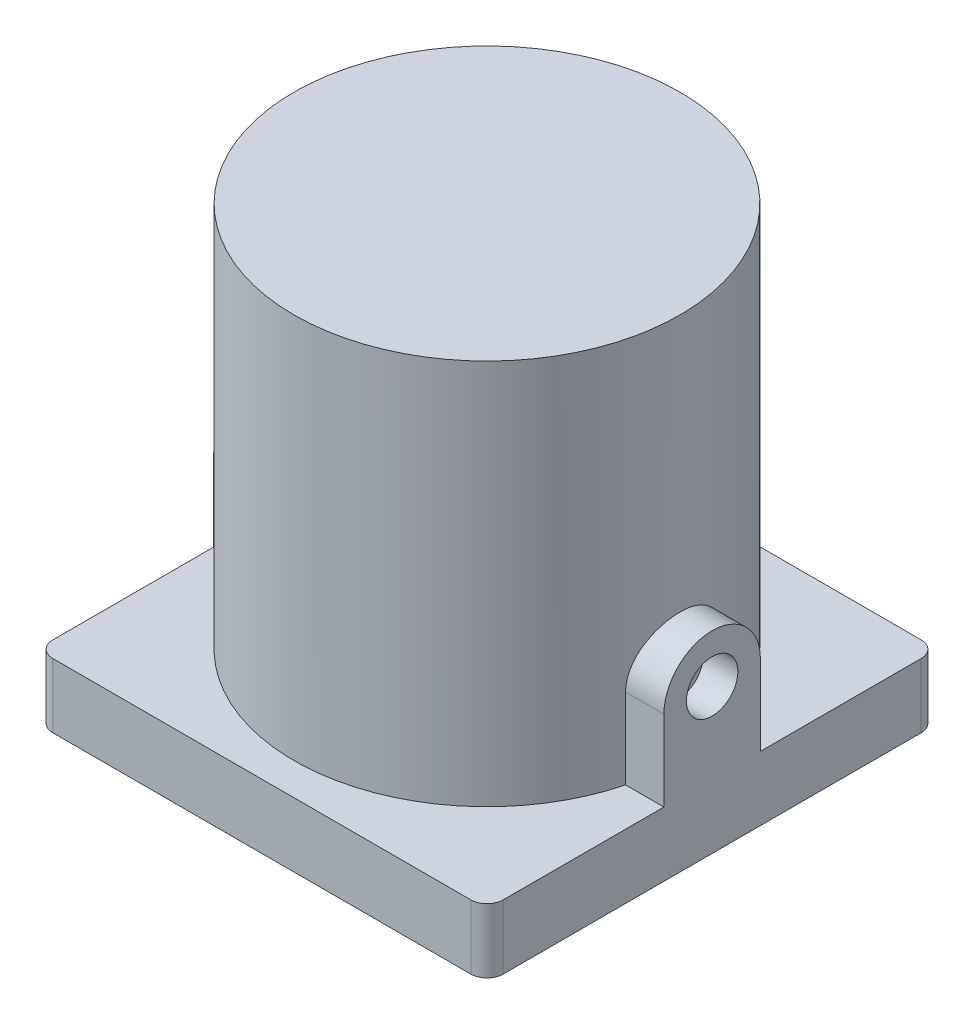
ISO-10303-21;
HEADER;
FILE_DESCRIPTION(('STEP AP214'),'2;1');
FILE_NAME('part.step','',(''),(''),'','','');
FILE_SCHEMA(('AUTOMOTIVE_DESIGN { 1 0 10303 214 1 1 1 1 }'));
ENDSEC;
DATA;
#1=APPLICATION_CONTEXT('core data for automotive mechanical design processes');
#2=APPLICATION_PROTOCOL_DEFINITION('international standard','automotive_design',2000,#1);
#3=PRODUCT_CONTEXT('',#1,'mechanical');
#4=PRODUCT('Part','Part','',(#3));
#5=PRODUCT_RELATED_PRODUCT_CATEGORY('part','',(#4));
#6=PRODUCT_DEFINITION_FORMATION('','',#4);
#7=PRODUCT_DEFINITION_CONTEXT('part definition',#1,'design');
#8=PRODUCT_DEFINITION('design','',#6,#7);
#9=PRODUCT_DEFINITION_SHAPE('','',#8);
#10=(LENGTH_UNIT() NAMED_UNIT(*) SI_UNIT(.MILLI.,.METRE.));
#11=(NAMED_UNIT(*) PLANE_ANGLE_UNIT() SI_UNIT($,.RADIAN.));
#12=(NAMED_UNIT(*) SI_UNIT($,.STERADIAN.) SOLID_ANGLE_UNIT());
#13=UNCERTAINTY_MEASURE_WITH_UNIT(LENGTH_MEASURE(1.E-05),#10,'distance_accuracy_value','');
#14=(GEOMETRIC_REPRESENTATION_CONTEXT(3) GLOBAL_UNCERTAINTY_ASSIGNED_CONTEXT((#13)) GLOBAL_UNIT_ASSIGNED_CONTEXT((#10,
#11,#12)) REPRESENTATION_CONTEXT('',''));
#15=CARTESIAN_POINT('',(0.,0.,0.));
#16=DIRECTION('',(0.,0.,1.));
#17=DIRECTION('',(1.,0.,0.));
#18=AXIS2_PLACEMENT_3D('',#15,#16,#17);
#19=CARTESIAN_POINT('',(7.00000000000002,4.5,0.));
#20=DIRECTION('',(-1.,0.,0.));
#21=DIRECTION('',(0.,0.,1.));
#22=AXIS2_PLACEMENT_3D('',#19,#20,#21);
#23=CYLINDRICAL_SURFACE('',#22,1.5);
#24=DIRECTION('',(-1.,0.,0.));
#25=VECTOR('',#24,1.);
#26=CARTESIAN_POINT('',(7.00000000000002,4.5,-1.5));
#27=LINE('',#26,#25);
#28=CARTESIAN_POINT('',(7.00000000000002,4.5,-1.5));
#29=VERTEX_POINT('',#28);
#30=CARTESIAN_POINT('',(5.80947501931113,4.5,-1.5));
#31=VERTEX_POINT('',#30);
#32=EDGE_CURVE('E186',#29,#31,#27,.T.);
#33=ORIENTED_EDGE('',*,*,#32,.T.);
#34=CARTESIAN_POINT('',(5.80947501931113,4.5,-1.5));
#35=CARTESIAN_POINT('',(5.80947222870266,4.54149447765981,-1.50000050624417));
#36=CARTESIAN_POINT('',(5.80992014924206,4.58296839452734,-1.49827711106305));
#37=CARTESIAN_POINT('',(5.81168857161838,4.66560605295535,-1.49140694309363));
#38=CARTESIAN_POINT('',(5.81300892662531,4.70676984553064,-1.48626074635902));
#39=CARTESIAN_POINT('',(5.81822566458081,4.82917975981327,-1.46576285907379));
#40=CARTESIAN_POINT('',(5.82337804723213,4.90958470272331,-1.44535154275874));
#41=CARTESIAN_POINT('',(5.83643133882004,5.06568701067295,-1.391697114372));
#42=CARTESIAN_POINT('',(5.84433198946395,5.14138481731929,-1.35845520813575));
#43=CARTESIAN_POINT('',(5.86198701707909,5.28616717297099,-1.2801230670388));
#44=CARTESIAN_POINT('',(5.87174189093471,5.35524994183645,-1.2350296550354));
#45=CARTESIAN_POINT('',(5.89224393597038,5.48631582285915,-1.1332267077421));
#46=CARTESIAN_POINT('',(5.90300686543374,5.54813232936828,-1.07630590317596));
#47=CARTESIAN_POINT('',(5.9241765659429,5.66145313422406,-0.952913670774345));
#48=CARTESIAN_POINT('',(5.93458327983806,5.71295578420192,-0.886440719218247));
#49=CARTESIAN_POINT('',(5.95404273424873,5.80486650242797,-0.744685349102536));
#50=CARTESIAN_POINT('',(5.96307457022595,5.84510984397596,-0.66929301050171));
#51=CARTESIAN_POINT('',(5.97858519375883,5.91228710129506,-0.512553886264378));
#52=CARTESIAN_POINT('',(5.98506448372051,5.93922363644975,-0.431208276124514));
#53=CARTESIAN_POINT('',(5.99462850007692,5.97848848916615,-0.26661616278774));
#54=CARTESIAN_POINT('',(5.99777929351951,5.99110150863423,-0.183441483004286));
#55=CARTESIAN_POINT('',(6.00056157226223,6.00225505731494,-0.0160991635225188));
#56=CARTESIAN_POINT('',(6.00019349990167,6.00079735528851,0.0680683500430589));
#57=CARTESIAN_POINT('',(5.99602856048604,5.98405505447182,0.233028739458145));
#58=CARTESIAN_POINT('',(5.99230798016041,5.96907807510078,0.313855052609783));
#59=CARTESIAN_POINT('',(5.98194495954744,5.92621698122588,0.47180806662651));
#60=CARTESIAN_POINT('',(5.97530238998334,5.89833229564713,0.548934603635982));
#61=CARTESIAN_POINT('',(5.95972496642698,5.83019807899402,0.698110929036809));
#62=CARTESIAN_POINT('',(5.95076990741333,5.78983890865074,0.770108444403372));
#63=CARTESIAN_POINT('',(5.93153918312879,5.6979853052498,0.906414946845021));
#64=CARTESIAN_POINT('',(5.92126331899798,5.64648919462017,0.970722773343433));
#65=CARTESIAN_POINT('',(5.90018349034298,5.53218163187803,1.09165408456274));
#66=CARTESIAN_POINT('',(5.88937275716528,5.46910254519028,1.14802365458119));
#67=CARTESIAN_POINT('',(5.8686925242601,5.3342551996084,1.24945436277936));
#68=CARTESIAN_POINT('',(5.8588232826449,5.26248457007466,1.29451240536759));
#69=CARTESIAN_POINT('',(5.84111720379488,5.11178160326435,1.37220706392894));
#70=CARTESIAN_POINT('',(5.83329159013705,5.03281280265587,1.4047755268309));
#71=CARTESIAN_POINT('',(5.82070588210583,4.87032460737257,1.45605352777474));
#72=CARTESIAN_POINT('',(5.81594120642153,4.78681221727524,1.4747837838182));
#73=CARTESIAN_POINT('',(5.81182936022286,4.66881392886164,1.49085695272641));
#74=CARTESIAN_POINT('',(5.8109478466629,4.63512044518023,1.49428618645006));
#75=CARTESIAN_POINT('',(5.80977093733462,4.56762331513602,1.49885513654609));
#76=CARTESIAN_POINT('',(5.80947459329191,4.53381993606707,1.49999855714407));
#77=CARTESIAN_POINT('',(5.80947501931113,4.5,1.5));
#78=B_SPLINE_CURVE_WITH_KNOTS('',3,(#34,#35,#36,#37,#38,#39,#40,#41,#42,#43,#44,#45,#46,#47,#48,
#49,#50,#51,#52,#53,#54,#55,#56,#57,#58,#59,#60,#61,#62,#63,#64,#65,#66,#67,#68,#69,#70,#71,#72,
#73,#74,#75,#76,#77),.UNSPECIFIED.,.F.,.F.,(4,2,2,2,2,2,2,2,2,2,2,2,2,2,2,2,2,2,2,2,2,4),(0.,
0.124404795509654,0.248788659126977,0.496844944620476,0.744877923137248,0.992977462090124,
1.24596284614196,1.49898863030879,1.75554280647352,2.01204646098637,2.26335722272987,
2.51463639384958,2.76033818218913,3.00605084213757,3.25398764175565,3.50196181446493,
3.75662144301813,4.01135068771451,4.26745080241601,4.52316671309979,4.62473773083972,
4.72614401597507),.UNSPECIFIED.);
#79=CARTESIAN_POINT('',(5.80947501931113,4.5,1.5));
#80=VERTEX_POINT('',#79);
#81=EDGE_CURVE('E171',#31,#80,#78,.T.);
#82=ORIENTED_EDGE('',*,*,#81,.T.);
#83=DIRECTION('',(-1.,0.,0.));
#84=VECTOR('',#83,1.);
#85=CARTESIAN_POINT('',(7.00000000000002,4.5,1.5));
#86=LINE('',#85,#84);
#87=CARTESIAN_POINT('',(7.00000000000002,4.5,1.5));
#88=VERTEX_POINT('',#87);
#89=EDGE_CURVE('E169',#88,#80,#86,.T.);
#90=ORIENTED_EDGE('',*,*,#89,.F.);
#91=CARTESIAN_POINT('',(7.00000000000002,4.5,0.));
#92=DIRECTION('',(-1.,0.,0.));
#93=DIRECTION('',(0.,0.,-1.));
#94=AXIS2_PLACEMENT_3D('',#91,#92,#93);
#95=CIRCLE('',#94,1.5);
#96=EDGE_CURVE('E301',#88,#29,#95,.T.);
#97=ORIENTED_EDGE('',*,*,#96,.T.);
#98=EDGE_LOOP('',(#33,#82,#90,#97));
#99=FACE_BOUND('',#98,.T.);
#100=ADVANCED_FACE('F37',(#99),#23,.T.);
#101=CARTESIAN_POINT('',(-5.80947501931113,4.5,1.5));
#102=VERTEX_POINT('',#101);
#103=CARTESIAN_POINT('',(-6.99999999999998,4.5,1.5));
#104=VERTEX_POINT('',#103);
#105=EDGE_CURVE('E177',#102,#104,#86,.T.);
#106=ORIENTED_EDGE('',*,*,#105,.F.);
#107=CARTESIAN_POINT('',(-5.80947501931113,4.5,1.5));
#108=CARTESIAN_POINT('',(-5.80947222870266,4.54149447765981,1.50000050624417));
#109=CARTESIAN_POINT('',(-5.80992014924206,4.58296839452735,1.49827711106305));
#110=CARTESIAN_POINT('',(-5.81168857161838,4.66560605295535,1.49140694309363));
#111=CARTESIAN_POINT('',(-5.81300892662531,4.70676984553064,1.48626074635902));
#112=CARTESIAN_POINT('',(-5.81822566458081,4.82917975981327,1.46576285907379));
#113=CARTESIAN_POINT('',(-5.82337804723214,4.90958470272332,1.44535154275874));
#114=CARTESIAN_POINT('',(-5.83643133882004,5.06568701067295,1.39169711437199));
#115=CARTESIAN_POINT('',(-5.84433198946395,5.14138481731929,1.35845520813575));
#116=CARTESIAN_POINT('',(-5.86198701707909,5.28616717297099,1.2801230670388));
#117=CARTESIAN_POINT('',(-5.87174189093471,5.35524994183645,1.2350296550354));
#118=CARTESIAN_POINT('',(-5.89224393597038,5.48631582285915,1.1332267077421));
#119=CARTESIAN_POINT('',(-5.90300686543374,5.54813232936828,1.07630590317596));
#120=CARTESIAN_POINT('',(-5.9241765659429,5.66145313422406,0.952913670774342));
#121=CARTESIAN_POINT('',(-5.93458327983806,5.71295578420192,0.886440719218244));
#122=CARTESIAN_POINT('',(-5.95404273424873,5.80486650242797,0.744685349102533));
#123=CARTESIAN_POINT('',(-5.96307457022596,5.84510984397596,0.669293010501707));
#124=CARTESIAN_POINT('',(-5.97858519375883,5.91228710129506,0.512553886264376));
#125=CARTESIAN_POINT('',(-5.98506448372051,5.93922363644975,0.431208276124512));
#126=CARTESIAN_POINT('',(-5.99462850007692,5.97848848916615,0.266616162787738));
#127=CARTESIAN_POINT('',(-5.99777929351951,5.99110150863423,0.183441483004284));
#128=CARTESIAN_POINT('',(-6.00056157226223,6.00225505731494,0.0160991635225165));
#129=CARTESIAN_POINT('',(-6.00019349990167,6.00079735528851,-0.0680683500430613));
#130=CARTESIAN_POINT('',(-5.99602856048604,5.98405505447182,-0.233028739458147));
#131=CARTESIAN_POINT('',(-5.99230798016041,5.96907807510078,-0.313855052609785));
#132=CARTESIAN_POINT('',(-5.98194495954744,5.92621698122588,-0.471808066626513));
#133=CARTESIAN_POINT('',(-5.97530238998334,5.89833229564713,-0.548934603635984));
#134=CARTESIAN_POINT('',(-5.95972496642698,5.83019807899402,-0.698110929036811));
#135=CARTESIAN_POINT('',(-5.95076990741333,5.78983890865074,-0.770108444403374));
#136=CARTESIAN_POINT('',(-5.93153918312879,5.6979853052498,-0.906414946845023));
#137=CARTESIAN_POINT('',(-5.92126331899798,5.64648919462017,-0.970722773343436));
#138=CARTESIAN_POINT('',(-5.90018349034298,5.53218163187803,-1.09165408456274));
#139=CARTESIAN_POINT('',(-5.88937275716528,5.46910254519028,-1.14802365458119));
#140=CARTESIAN_POINT('',(-5.8686925242601,5.3342551996084,-1.24945436277936));
#141=CARTESIAN_POINT('',(-5.8588232826449,5.26248457007466,-1.29451240536759));
#142=CARTESIAN_POINT('',(-5.84111720379488,5.11178160326435,-1.37220706392894));
#143=CARTESIAN_POINT('',(-5.83329159013705,5.03281280265587,-1.40477552683091));
#144=CARTESIAN_POINT('',(-5.82070588210583,4.87032460737257,-1.45605352777474));
#145=CARTESIAN_POINT('',(-5.81594120642153,4.78681221727524,-1.4747837838182));
#146=CARTESIAN_POINT('',(-5.81182936022286,4.66881392886164,-1.49085695272641));
#147=CARTESIAN_POINT('',(-5.81094784666289,4.63512044518023,-1.49428618645006));
#148=CARTESIAN_POINT('',(-5.80977093733462,4.56762331513602,-1.49885513654609));
#149=CARTESIAN_POINT('',(-5.80947459329191,4.53381993606707,-1.49999855714407));
#150=CARTESIAN_POINT('',(-5.80947501931113,4.5,-1.5));
#151=B_SPLINE_CURVE_WITH_KNOTS('',3,(#107,#108,#109,#110,#111,#112,#113,#114,#115,#116,#117,
#118,#119,#120,#121,#122,#123,#124,#125,#126,#127,#128,#129,#130,#131,#132,#133,#134,#135,#136,
#137,#138,#139,#140,#141,#142,#143,#144,#145,#146,#147,#148,#149,#150),.UNSPECIFIED.,.F.,.F.,(4,
2,2,2,2,2,2,2,2,2,2,2,2,2,2,2,2,2,2,2,2,4),(0.,0.124404795509654,0.248788659126977,
0.496844944620476,0.744877923137249,0.992977462090124,1.24596284614196,1.49898863030879,
1.75554280647352,2.01204646098637,2.26335722272987,2.51463639384958,2.76033818218913,
3.00605084213757,3.25398764175565,3.50196181446493,3.75662144301813,4.01135068771451,
4.26745080241601,4.52316671309979,4.62473773083972,4.72614401597507),.UNSPECIFIED.);
#152=CARTESIAN_POINT('',(-5.80947501931113,4.5,-1.5));
#153=VERTEX_POINT('',#152);
#154=EDGE_CURVE('E267',#102,#153,#151,.T.);
#155=ORIENTED_EDGE('',*,*,#154,.T.);
#156=CARTESIAN_POINT('',(-6.99999999999998,4.5,-1.5));
#157=VERTEX_POINT('',#156);
#158=EDGE_CURVE('E189',#153,#157,#27,.T.);
#159=ORIENTED_EDGE('',*,*,#158,.T.);
#160=CARTESIAN_POINT('',(-6.99999999999998,4.5,0.));
#161=DIRECTION('',(-1.,0.,0.));
#162=DIRECTION('',(0.,0.,-1.));
#163=AXIS2_PLACEMENT_3D('',#160,#161,#162);
#164=CIRCLE('',#163,1.5);
#165=EDGE_CURVE('E298',#104,#157,#164,.T.);
#166=ORIENTED_EDGE('',*,*,#165,.F.);
#167=EDGE_LOOP('',(#106,#155,#159,#166));
#168=FACE_BOUND('',#167,.T.);
#169=ADVANCED_FACE('F283',(#168),#23,.T.);
#170=CARTESIAN_POINT('',(7.00000000000002,2.,1.5));
#171=DIRECTION('',(0.,0.,1.));
#172=DIRECTION('',(0.,-1.,0.));
#173=AXIS2_PLACEMENT_3D('',#170,#171,#172);
#174=PLANE('',#173);
#175=DIRECTION('',(-1.,0.,0.));
#176=VECTOR('',#175,1.);
#177=CARTESIAN_POINT('',(7.00000000000002,2.,1.5));
#178=LINE('',#177,#176);
#179=CARTESIAN_POINT('',(-5.80947501931113,2.,1.5));
#180=VERTEX_POINT('',#179);
#181=CARTESIAN_POINT('',(-6.99999999999998,2.,1.5));
#182=VERTEX_POINT('',#181);
#183=EDGE_CURVE('E65',#180,#182,#178,.T.);
#184=ORIENTED_EDGE('',*,*,#183,.F.);
#185=DIRECTION('',(0.,-1.,0.));
#186=VECTOR('',#185,1.);
#187=CARTESIAN_POINT('',(-5.80947501931114,44.9705627484771,1.49999999999996));
#188=LINE('',#187,#186);
#189=EDGE_CURVE('E160',#180,#102,#188,.F.);
#190=ORIENTED_EDGE('',*,*,#189,.T.);
#191=ORIENTED_EDGE('',*,*,#105,.T.);
#192=DIRECTION('',(0.,1.,0.));
#193=VECTOR('',#192,1.);
#194=CARTESIAN_POINT('',(-6.99999999999998,2.,1.5));
#195=LINE('',#194,#193);
#196=EDGE_CURVE('E305',#182,#104,#195,.T.);
#197=ORIENTED_EDGE('',*,*,#196,.F.);
#198=EDGE_LOOP('',(#184,#190,#191,#197));
#199=FACE_BOUND('',#198,.T.);
#200=ADVANCED_FACE('F320',(#199),#174,.T.);
#201=ORIENTED_EDGE('',*,*,#89,.T.);
#202=DIRECTION('',(0.,-1.,0.));
#203=VECTOR('',#202,1.);
#204=CARTESIAN_POINT('',(5.80947501931114,44.9705627484771,1.49999999999996));
#205=LINE('',#204,#203);
#206=CARTESIAN_POINT('',(5.80947501931113,2.,1.5));
#207=VERTEX_POINT('',#206);
#208=EDGE_CURVE('E157',#80,#207,#205,.T.);
#209=ORIENTED_EDGE('',*,*,#208,.T.);
#210=CARTESIAN_POINT('',(7.00000000000002,2.,1.5));
#211=VERTEX_POINT('',#210);
#212=EDGE_CURVE('E167',#211,#207,#178,.T.);
#213=ORIENTED_EDGE('',*,*,#212,.F.);
#214=DIRECTION('',(0.,1.,0.));
#215=VECTOR('',#214,1.);
#216=CARTESIAN_POINT('',(7.00000000000002,2.,1.5));
#217=LINE('',#216,#215);
#218=EDGE_CURVE('E307',#211,#88,#217,.T.);
#219=ORIENTED_EDGE('',*,*,#218,.T.);
#220=EDGE_LOOP('',(#201,#209,#213,#219));
#221=FACE_BOUND('',#220,.T.);
#222=ADVANCED_FACE('F165',(#221),#174,.T.);
#223=CARTESIAN_POINT('',(7.00000000000002,4.5,-1.5));
#224=DIRECTION('',(0.,0.,-1.));
#225=DIRECTION('',(-1.,0.,0.));
#226=AXIS2_PLACEMENT_3D('',#223,#224,#225);
#227=PLANE('',#226);
#228=DIRECTION('',(-1.,0.,0.));
#229=VECTOR('',#228,1.);
#230=CARTESIAN_POINT('',(7.00000000000002,2.,-1.5));
#231=LINE('',#230,#229);
#232=CARTESIAN_POINT('',(7.00000000000002,2.,-1.5));
#233=VERTEX_POINT('',#232);
#234=CARTESIAN_POINT('',(5.80947501931113,2.,-1.5));
#235=VERTEX_POINT('',#234);
#236=EDGE_CURVE('E180',#233,#235,#231,.T.);
#237=ORIENTED_EDGE('',*,*,#236,.T.);
#238=DIRECTION('',(0.,-1.,0.));
#239=VECTOR('',#238,1.);
#240=CARTESIAN_POINT('',(5.80947501931113,44.9705627484771,-1.5));
#241=LINE('',#240,#239);
#242=EDGE_CURVE('E293',#235,#31,#241,.F.);
#243=ORIENTED_EDGE('',*,*,#242,.T.);
#244=ORIENTED_EDGE('',*,*,#32,.F.);
#245=DIRECTION('',(0.,-1.,0.));
#246=VECTOR('',#245,1.);
#247=CARTESIAN_POINT('',(7.00000000000002,4.5,-1.5));
#248=LINE('',#247,#246);
#249=EDGE_CURVE('E304',#29,#233,#248,.T.);
#250=ORIENTED_EDGE('',*,*,#249,.T.);
#251=EDGE_LOOP('',(#237,#243,#244,#250));
#252=FACE_BOUND('',#251,.T.);
#253=ADVANCED_FACE('F285',(#252),#227,.T.);
#254=ORIENTED_EDGE('',*,*,#158,.F.);
#255=DIRECTION('',(0.,-1.,0.));
#256=VECTOR('',#255,1.);
#257=CARTESIAN_POINT('',(-5.80947501931113,44.9705627484771,-1.5));
#258=LINE('',#257,#256);
#259=CARTESIAN_POINT('',(-5.80947501931113,2.,-1.5));
#260=VERTEX_POINT('',#259);
#261=EDGE_CURVE('E276',#153,#260,#258,.T.);
#262=ORIENTED_EDGE('',*,*,#261,.T.);
#263=CARTESIAN_POINT('',(-6.99999999999998,2.,-1.5));
#264=VERTEX_POINT('',#263);
#265=EDGE_CURVE('E185',#260,#264,#231,.T.);
#266=ORIENTED_EDGE('',*,*,#265,.T.);
#267=DIRECTION('',(0.,-1.,0.));
#268=VECTOR('',#267,1.);
#269=CARTESIAN_POINT('',(-6.99999999999998,4.5,-1.5));
#270=LINE('',#269,#268);
#271=EDGE_CURVE('E311',#157,#264,#270,.T.);
#272=ORIENTED_EDGE('',*,*,#271,.F.);
#273=EDGE_LOOP('',(#254,#262,#266,#272));
#274=FACE_BOUND('',#273,.T.);
#275=ADVANCED_FACE('F326',(#274),#227,.T.);
#276=CARTESIAN_POINT('',(7.00000000000002,4.5,0.));
#277=DIRECTION('',(-1.,0.,0.));
#278=DIRECTION('',(0.,0.,1.));
#279=AXIS2_PLACEMENT_3D('',#276,#277,#278);
#280=CYLINDRICAL_SURFACE('',#279,0.8);
#281=CARTESIAN_POINT('',(7.00000000000002,4.5,0.));
#282=DIRECTION('',(-1.,0.,0.));
#283=DIRECTION('',(0.,0.,1.));
#284=AXIS2_PLACEMENT_3D('',#281,#282,#283);
#285=CIRCLE('',#284,0.8);
#286=CARTESIAN_POINT('',(7.00000000000002,4.5,0.799999999999999));
#287=VERTEX_POINT('',#286);
#288=EDGE_CURVE('E295',#287,#287,#285,.T.);
#289=ORIENTED_EDGE('',*,*,#288,.F.);
#290=EDGE_LOOP('',(#289));
#291=FACE_BOUND('',#290,.T.);
#292=CARTESIAN_POINT('',(5.9464274989274,4.5,0.799999999999999));
#293=CARTESIAN_POINT('',(5.94642817813305,4.4552784578159,0.799998114379368));
#294=CARTESIAN_POINT('',(5.94693745897463,4.41052958676287,0.796237306818277));
#295=CARTESIAN_POINT('',(5.94891859481411,4.32227901507443,0.781295185066218));
#296=CARTESIAN_POINT('',(5.95039143464563,4.27877863803487,0.770106278596628));
#297=CARTESIAN_POINT('',(5.95412996846747,4.19431545270638,0.740645244560409));
#298=CARTESIAN_POINT('',(5.95639510221776,4.15335087535209,0.722378121100004));
#299=CARTESIAN_POINT('',(5.96146232903785,4.075075569717,0.679290259522917));
#300=CARTESIAN_POINT('',(5.9642643359229,4.03776425642501,0.654470573053921));
#301=CARTESIAN_POINT('',(5.9701095092747,3.96761061813239,0.598813481958022));
#302=CARTESIAN_POINT('',(5.97315395397272,3.93479485372819,0.567942729099424));
#303=CARTESIAN_POINT('',(5.97912950503515,3.87479350181751,0.501131691490452));
#304=CARTESIAN_POINT('',(5.98206060557357,3.84760820340954,0.465191146588795));
#305=CARTESIAN_POINT('',(5.98749239904087,3.79954326331342,0.38909268997104));
#306=CARTESIAN_POINT('',(5.98999142600895,3.7786878042839,0.348919375084487));
#307=CARTESIAN_POINT('',(5.9942634136634,3.74402953432768,0.265601526414947));
#308=CARTESIAN_POINT('',(5.99603640485843,3.73022642704893,0.222457117568959));
#309=CARTESIAN_POINT('',(5.99864754478239,3.71014443616789,0.134694150005634));
#310=CARTESIAN_POINT('',(5.99949119282029,3.70382127399522,0.090085889387958));
#311=CARTESIAN_POINT('',(6.00016739188608,3.69874135650527,0.000434000921461776));
#312=CARTESIAN_POINT('',(5.99999998785132,3.69998426490539,-0.0446096074889873));
#313=CARTESIAN_POINT('',(5.99867737646763,3.70996589221638,-0.133552049786309));
#314=CARTESIAN_POINT('',(5.99752844535123,3.71865698589826,-0.177456334944715));
#315=CARTESIAN_POINT('',(5.99437889636916,3.7432137308086,-0.263177649085023));
#316=CARTESIAN_POINT('',(5.99237826045613,3.75907953406724,-0.304994633816737));
#317=CARTESIAN_POINT('',(5.98773927601666,3.79758537644873,-0.385500723369652));
#318=CARTESIAN_POINT('',(5.98509900858351,3.82024584927323,-0.424179939741305));
#319=CARTESIAN_POINT('',(5.97947580167616,3.87168290291314,-0.497204676293916));
#320=CARTESIAN_POINT('',(5.97649284433716,3.90045980265112,-0.531549970346728));
#321=CARTESIAN_POINT('',(5.97049035238265,3.96357913934357,-0.595212024618156));
#322=CARTESIAN_POINT('',(5.9674707136976,3.99796310727745,-0.624487613412085));
#323=CARTESIAN_POINT('',(5.96175799507695,4.07117837254903,-0.676858772228765));
#324=CARTESIAN_POINT('',(5.9590649164363,4.11000968752119,-0.699954317745413));
#325=CARTESIAN_POINT('',(5.95431030533736,4.19105600013868,-0.739313144346001));
#326=CARTESIAN_POINT('',(5.95224910485914,4.23327276180739,-0.755572835626827));
#327=CARTESIAN_POINT('',(5.94899790186288,4.31987120825535,-0.780760360179697));
#328=CARTESIAN_POINT('',(5.94780785134465,4.36425277361062,-0.789688597416574));
#329=CARTESIAN_POINT('',(5.94644258004139,4.45355653400198,-0.799904643074909));
#330=CARTESIAN_POINT('',(5.94625964604651,4.49847197213301,-0.801250524395249));
#331=CARTESIAN_POINT('',(5.94690889718679,4.5878877024419,-0.796417152755184));
#332=CARTESIAN_POINT('',(5.947741057619,4.63238800469578,-0.790238082919107));
#333=CARTESIAN_POINT('',(5.95031968174708,4.71953439456224,-0.77057922014808));
#334=CARTESIAN_POINT('',(5.9520625911506,4.76218699720724,-0.75712780129344));
#335=CARTESIAN_POINT('',(5.95626343605763,4.84463156538097,-0.723335380320502));
#336=CARTESIAN_POINT('',(5.95872139993137,4.88442341732949,-0.702994104837533));
#337=CARTESIAN_POINT('',(5.96409378647807,4.96027892417632,-0.655857625668844));
#338=CARTESIAN_POINT('',(5.96701085515654,4.99631881934729,-0.629024492665202));
#339=CARTESIAN_POINT('',(5.97296457406604,5.06340437537483,-0.569719329251196));
#340=CARTESIAN_POINT('',(5.97600122959973,5.09444981445921,-0.537247048575017));
#341=CARTESIAN_POINT('',(5.98187579462133,5.15087062156845,-0.467331019343296));
#342=CARTESIAN_POINT('',(5.98471228019887,5.17620772654864,-0.42985625637301));
#343=CARTESIAN_POINT('',(5.98984536591321,5.22022731287013,-0.351148980927049));
#344=CARTESIAN_POINT('',(5.99214197819397,5.23890994390244,-0.309916553005481));
#345=CARTESIAN_POINT('',(5.99593025876462,5.26902770463525,-0.224989109009374));
#346=CARTESIAN_POINT('',(5.99742433928313,5.28048457163342,-0.181301913698945));
#347=CARTESIAN_POINT('',(5.99944926674647,5.29589619418439,-0.09260259736928));
#348=CARTESIAN_POINT('',(5.9999801634245,5.29985133708308,-0.04759054487993));
#349=CARTESIAN_POINT('',(6.00001858899368,5.30013930689613,0.0421079494846348));
#350=CARTESIAN_POINT('',(5.99953401965371,5.29653098823776,0.0867942103687515));
#351=CARTESIAN_POINT('',(5.99761173287944,5.28191958350721,0.174918977220941));
#352=CARTESIAN_POINT('',(5.99617401678004,5.27091650779148,0.218357484936418));
#353=CARTESIAN_POINT('',(5.99250622656988,5.24184718116933,0.302743293835543));
#354=CARTESIAN_POINT('',(5.99027651363326,5.22378414943678,0.343691720617563));
#355=CARTESIAN_POINT('',(5.98527099758394,5.1811137801417,0.421985631452349));
#356=CARTESIAN_POINT('',(5.98249518438796,5.15650632173902,0.459331048959665));
#357=CARTESIAN_POINT('',(5.97668116483941,5.10122932719854,0.529658914426694));
#358=CARTESIAN_POINT('',(5.97364116119964,5.07051608394432,0.562606862865599));
#359=CARTESIAN_POINT('',(5.96765545958707,5.00399077238105,0.622903582348864));
#360=CARTESIAN_POINT('',(5.96470978404026,4.96817750243149,0.650251030120924));
#361=CARTESIAN_POINT('',(5.95923243954024,4.89228642337165,0.698675163913982));
#362=CARTESIAN_POINT('',(5.95670264704317,4.85219056339599,0.719723761716512));
#363=CARTESIAN_POINT('',(5.95236546633496,4.76902061299315,0.754758073125953));
#364=CARTESIAN_POINT('',(5.95055730408915,4.72594977209613,0.768751358665435));
#365=CARTESIAN_POINT('',(5.94830053529977,4.65222068850986,0.78598192151435));
#366=CARTESIAN_POINT('',(5.94760171448888,4.622024690813,0.791230992543271));
#367=CARTESIAN_POINT('',(5.94666496589785,4.56122339621154,0.798240661372663));
#368=CARTESIAN_POINT('',(5.94642703391686,4.53061810304008,0.800001290969048));
#369=CARTESIAN_POINT('',(5.9464274989274,4.5,0.799999999999999));
#370=B_SPLINE_CURVE_WITH_KNOTS('',3,(#292,#293,#294,#295,#296,#297,#298,#299,#300,#301,#302,
#303,#304,#305,#306,#307,#308,#309,#310,#311,#312,#313,#314,#315,#316,#317,#318,#319,#320,#321,
#322,#323,#324,#325,#326,#327,#328,#329,#330,#331,#332,#333,#334,#335,#336,#337,#338,#339,#340,
#341,#342,#343,#344,#345,#346,#347,#348,#349,#350,#351,#352,#353,#354,#355,#356,#357,#358,#359,
#360,#361,#362,#363,#364,#365,#366,#367,#368,#369),.UNSPECIFIED.,.T.,.F.,(4,2,2,2,2,2,2,2,2,2,2,
2,2,2,2,2,2,2,2,2,2,2,2,2,2,2,2,2,2,2,2,2,2,2,2,2,2,2,4),(0.,0.13405275569564,0.268242738433457,
0.402338025098482,0.53641180333101,0.671246380475845,0.806087879040137,0.94143822609177,
1.07678288501889,1.21132227809106,1.34585569145061,1.47953523467099,1.6132176106579,
1.74730611381619,1.8814016103297,2.01653966026702,2.15167824606755,2.28688771061415,
2.42208972458759,2.5562548103189,2.69041663112535,2.82405873926556,2.95770615046402,
3.09215411256052,3.22660804299367,3.3619380470492,3.49726500669179,3.63218289507252,
3.76709381687977,3.90095883941638,4.03482367447375,4.16862754139196,4.3024338791155,
4.43723496946696,4.57206787362879,4.70749336791959,4.84277320924414,4.9345517637682,
5.02632948175922),.UNSPECIFIED.);
#371=CARTESIAN_POINT('',(5.9464274989274,4.5,0.799999999999999));
#372=VERTEX_POINT('',#371);
#373=EDGE_CURVE('E12',#372,#372,#370,.T.);
#374=ORIENTED_EDGE('',*,*,#373,.F.);
#375=EDGE_LOOP('',(#374));
#376=FACE_BOUND('',#375,.T.);
#377=ADVANCED_FACE('F253',(#291,#376),#280,.F.);
#378=CARTESIAN_POINT('',(-6.99999999999998,4.5,0.));
#379=DIRECTION('',(-1.,0.,0.));
#380=DIRECTION('',(0.,0.,1.));
#381=AXIS2_PLACEMENT_3D('',#378,#379,#380);
#382=CIRCLE('',#381,0.8);
#383=CARTESIAN_POINT('',(-6.99999999999998,4.5,0.799999999999999));
#384=VERTEX_POINT('',#383);
#385=EDGE_CURVE('E170',#384,#384,#382,.T.);
#386=ORIENTED_EDGE('',*,*,#385,.T.);
#387=EDGE_LOOP('',(#386));
#388=FACE_BOUND('',#387,.T.);
#389=CARTESIAN_POINT('',(-5.9464274989274,4.5,0.799999999999999));
#390=CARTESIAN_POINT('',(-5.94642817813305,4.5447215421841,0.799998114379368));
#391=CARTESIAN_POINT('',(-5.94693745897463,4.58947041323713,0.796237306818277));
#392=CARTESIAN_POINT('',(-5.94891859481411,4.67772098492557,0.781295185066218));
#393=CARTESIAN_POINT('',(-5.95039143464563,4.72122136196513,0.770106278596628));
#394=CARTESIAN_POINT('',(-5.95412996846747,4.80568454729362,0.740645244560409));
#395=CARTESIAN_POINT('',(-5.95639510221776,4.84664912464791,0.722378121100004));
#396=CARTESIAN_POINT('',(-5.96146232903785,4.924924430283,0.679290259522917));
#397=CARTESIAN_POINT('',(-5.9642643359229,4.96223574357499,0.654470573053921));
#398=CARTESIAN_POINT('',(-5.9701095092747,5.03238938186761,0.598813481958023));
#399=CARTESIAN_POINT('',(-5.97315395397272,5.06520514627181,0.567942729099424));
#400=CARTESIAN_POINT('',(-5.97912950503515,5.12520649818249,0.501131691490452));
#401=CARTESIAN_POINT('',(-5.98206060557357,5.15239179659046,0.465191146588795));
#402=CARTESIAN_POINT('',(-5.98749239904087,5.20045673668658,0.38909268997104));
#403=CARTESIAN_POINT('',(-5.98999142600895,5.2213121957161,0.348919375084487));
#404=CARTESIAN_POINT('',(-5.9942634136634,5.25597046567232,0.265601526414946));
#405=CARTESIAN_POINT('',(-5.99603640485843,5.26977357295107,0.222457117568959));
#406=CARTESIAN_POINT('',(-5.99864754478239,5.28985556383211,0.134694150005634));
#407=CARTESIAN_POINT('',(-5.99949119282029,5.29617872600478,0.0900858893879577));
#408=CARTESIAN_POINT('',(-6.00016739188608,5.30125864349473,0.000434000921461403));
#409=CARTESIAN_POINT('',(-5.99999998785132,5.30001573509461,-0.0446096074889876));
#410=CARTESIAN_POINT('',(-5.99867737646763,5.29003410778362,-0.133552049786309));
#411=CARTESIAN_POINT('',(-5.99752844535123,5.28134301410174,-0.177456334944715));
#412=CARTESIAN_POINT('',(-5.99437889636916,5.2567862691914,-0.263177649085023));
#413=CARTESIAN_POINT('',(-5.99237826045613,5.24092046593275,-0.304994633816737));
#414=CARTESIAN_POINT('',(-5.98773927601666,5.20241462355127,-0.385500723369652));
#415=CARTESIAN_POINT('',(-5.98509900858351,5.17975415072677,-0.424179939741305));
#416=CARTESIAN_POINT('',(-5.97947580167616,5.12831709708686,-0.497204676293916));
#417=CARTESIAN_POINT('',(-5.97649284433716,5.09954019734888,-0.531549970346728));
#418=CARTESIAN_POINT('',(-5.97049035238265,5.03642086065643,-0.595212024618156));
#419=CARTESIAN_POINT('',(-5.9674707136976,5.00203689272255,-0.624487613412085));
#420=CARTESIAN_POINT('',(-5.96175799507695,4.92882162745097,-0.676858772228765));
#421=CARTESIAN_POINT('',(-5.9590649164363,4.88999031247881,-0.699954317745414));
#422=CARTESIAN_POINT('',(-5.95431030533736,4.80894399986132,-0.739313144346001));
#423=CARTESIAN_POINT('',(-5.95224910485914,4.7667272381926,-0.755572835626828));
#424=CARTESIAN_POINT('',(-5.94899790186288,4.68012879174465,-0.780760360179697));
#425=CARTESIAN_POINT('',(-5.94780785134465,4.63574722638937,-0.789688597416574));
#426=CARTESIAN_POINT('',(-5.94644258004139,4.54644346599802,-0.799904643074909));
#427=CARTESIAN_POINT('',(-5.94625964604651,4.50152802786699,-0.801250524395249));
#428=CARTESIAN_POINT('',(-5.94690889718679,4.4121122975581,-0.796417152755184));
#429=CARTESIAN_POINT('',(-5.947741057619,4.36761199530422,-0.790238082919107));
#430=CARTESIAN_POINT('',(-5.95031968174708,4.28046560543775,-0.77057922014808));
#431=CARTESIAN_POINT('',(-5.9520625911506,4.23781300279276,-0.75712780129344));
#432=CARTESIAN_POINT('',(-5.95626343605763,4.15536843461903,-0.723335380320502));
#433=CARTESIAN_POINT('',(-5.95872139993137,4.11557658267051,-0.702994104837533));
#434=CARTESIAN_POINT('',(-5.96409378647807,4.03972107582367,-0.655857625668844));
#435=CARTESIAN_POINT('',(-5.96701085515654,4.00368118065271,-0.629024492665202));
#436=CARTESIAN_POINT('',(-5.97296457406604,3.93659562462516,-0.569719329251196));
#437=CARTESIAN_POINT('',(-5.97600122959973,3.90555018554079,-0.537247048575017));
#438=CARTESIAN_POINT('',(-5.98187579462133,3.84912937843155,-0.467331019343296));
#439=CARTESIAN_POINT('',(-5.98471228019887,3.82379227345135,-0.42985625637301));
#440=CARTESIAN_POINT('',(-5.98984536591321,3.77977268712987,-0.351148980927049));
#441=CARTESIAN_POINT('',(-5.99214197819397,3.76109005609756,-0.309916553005481));
#442=CARTESIAN_POINT('',(-5.99593025876462,3.73097229536475,-0.224989109009374));
#443=CARTESIAN_POINT('',(-5.99742433928313,3.71951542836658,-0.181301913698946));
#444=CARTESIAN_POINT('',(-5.99944926674647,3.70410380581561,-0.0926025973692804));
#445=CARTESIAN_POINT('',(-5.9999801634245,3.70014866291691,-0.0475905448799303));
#446=CARTESIAN_POINT('',(-6.00001858899368,3.69986069310387,0.0421079494846345));
#447=CARTESIAN_POINT('',(-5.99953401965371,3.70346901176224,0.0867942103687511));
#448=CARTESIAN_POINT('',(-5.99761173287944,3.71808041649279,0.17491897722094));
#449=CARTESIAN_POINT('',(-5.99617401678004,3.72908349220852,0.218357484936418));
#450=CARTESIAN_POINT('',(-5.99250622656988,3.75815281883067,0.302743293835543));
#451=CARTESIAN_POINT('',(-5.99027651363326,3.77621585056322,0.343691720617563));
#452=CARTESIAN_POINT('',(-5.98527099758394,3.81888621985829,0.421985631452348));
#453=CARTESIAN_POINT('',(-5.98249518438796,3.84349367826098,0.459331048959665));
#454=CARTESIAN_POINT('',(-5.97668116483941,3.89877067280146,0.529658914426694));
#455=CARTESIAN_POINT('',(-5.97364116119964,3.92948391605568,0.562606862865599));
#456=CARTESIAN_POINT('',(-5.96765545958707,3.99600922761895,0.622903582348864));
#457=CARTESIAN_POINT('',(-5.96470978404026,4.03182249756851,0.650251030120924));
#458=CARTESIAN_POINT('',(-5.95923243954024,4.10771357662835,0.698675163913982));
#459=CARTESIAN_POINT('',(-5.95670264704317,4.14780943660401,0.719723761716512));
#460=CARTESIAN_POINT('',(-5.95236546633496,4.23097938700685,0.754758073125953));
#461=CARTESIAN_POINT('',(-5.95055730408915,4.27405022790387,0.768751358665435));
#462=CARTESIAN_POINT('',(-5.94830053529977,4.34777931149013,0.78598192151435));
#463=CARTESIAN_POINT('',(-5.94760171448888,4.377975309187,0.791230992543271));
#464=CARTESIAN_POINT('',(-5.94666496589785,4.43877660378846,0.798240661372663));
#465=CARTESIAN_POINT('',(-5.94642703391686,4.46938189695992,0.800001290969048));
#466=CARTESIAN_POINT('',(-5.9464274989274,4.5,0.799999999999999));
#467=B_SPLINE_CURVE_WITH_KNOTS('',3,(#389,#390,#391,#392,#393,#394,#395,#396,#397,#398,#399,
#400,#401,#402,#403,#404,#405,#406,#407,#408,#409,#410,#411,#412,#413,#414,#415,#416,#417,#418,
#419,#420,#421,#422,#423,#424,#425,#426,#427,#428,#429,#430,#431,#432,#433,#434,#435,#436,#437,
#438,#439,#440,#441,#442,#443,#444,#445,#446,#447,#448,#449,#450,#451,#452,#453,#454,#455,#456,
#457,#458,#459,#460,#461,#462,#463,#464,#465,#466),.UNSPECIFIED.,.T.,.F.,(4,2,2,2,2,2,2,2,2,2,2,
2,2,2,2,2,2,2,2,2,2,2,2,2,2,2,2,2,2,2,2,2,2,2,2,2,2,2,4),(0.,0.13405275569564,0.268242738433457,
0.402338025098482,0.53641180333101,0.671246380475845,0.806087879040137,0.94143822609177,
1.07678288501889,1.21132227809106,1.34585569145061,1.47953523467099,1.6132176106579,
1.74730611381619,1.8814016103297,2.01653966026702,2.15167824606755,2.28688771061415,
2.42208972458759,2.5562548103189,2.69041663112535,2.82405873926556,2.95770615046402,
3.09215411256051,3.22660804299367,3.3619380470492,3.49726500669179,3.63218289507252,
3.76709381687977,3.90095883941638,4.03482367447375,4.16862754139196,4.3024338791155,
4.43723496946696,4.57206787362879,4.70749336791959,4.84277320924414,4.9345517637682,
5.02632948175922),.UNSPECIFIED.);
#468=CARTESIAN_POINT('',(-5.9464274989274,4.5,0.799999999999999));
#469=VERTEX_POINT('',#468);
#470=EDGE_CURVE('E50',#469,#469,#467,.T.);
#471=ORIENTED_EDGE('',*,*,#470,.F.);
#472=EDGE_LOOP('',(#471));
#473=FACE_BOUND('',#472,.T.);
#474=ADVANCED_FACE('F393',(#388,#473),#280,.F.);
#475=CARTESIAN_POINT('',(-6.49999999999998,2.,-6.50000000000001));
#476=DIRECTION('',(0.,1.,0.));
#477=DIRECTION('',(0.,0.,1.));
#478=AXIS2_PLACEMENT_3D('',#475,#476,#477);
#479=PLANE('',#478);
#480=ORIENTED_EDGE('',*,*,#212,.T.);
#481=CARTESIAN_POINT('',(0.,2.,0.));
#482=DIRECTION('',(0.,1.,0.));
#483=DIRECTION('',(0.,0.,1.));
#484=AXIS2_PLACEMENT_3D('',#481,#482,#483);
#485=CIRCLE('',#484,6.);
#486=EDGE_CURVE('E153',#180,#207,#485,.T.);
#487=ORIENTED_EDGE('',*,*,#486,.F.);
#488=ORIENTED_EDGE('',*,*,#183,.T.);
#489=DIRECTION('',(0.,0.,1.));
#490=VECTOR('',#489,1.);
#491=CARTESIAN_POINT('',(-6.99999999999998,2.,-6.5));
#492=LINE('',#491,#490);
#493=CARTESIAN_POINT('',(-6.99999999999998,2.,6.5));
#494=VERTEX_POINT('',#493);
#495=EDGE_CURVE('E193',#182,#494,#492,.T.);
#496=ORIENTED_EDGE('',*,*,#495,.T.);
#497=CARTESIAN_POINT('',(-6.49999999999998,2.,6.50000000000001));
#498=DIRECTION('',(0.,1.,0.));
#499=DIRECTION('',(0.,0.,1.));
#500=AXIS2_PLACEMENT_3D('',#497,#498,#499);
#501=CIRCLE('',#500,0.5);
#502=CARTESIAN_POINT('',(-6.49999999999998,2.,7.00000000000001));
#503=VERTEX_POINT('',#502);
#504=EDGE_CURVE('E198',#494,#503,#501,.T.);
#505=ORIENTED_EDGE('',*,*,#504,.T.);
#506=DIRECTION('',(1.,0.,0.));
#507=VECTOR('',#506,1.);
#508=CARTESIAN_POINT('',(-6.49999999999998,2.,7.00000000000001));
#509=LINE('',#508,#507);
#510=CARTESIAN_POINT('',(6.50000000000001,2.,7.00000000000001));
#511=VERTEX_POINT('',#510);
#512=EDGE_CURVE('E200',#503,#511,#509,.T.);
#513=ORIENTED_EDGE('',*,*,#512,.T.);
#514=CARTESIAN_POINT('',(6.50000000000002,2.,6.50000000000001));
#515=DIRECTION('',(0.,1.,0.));
#516=DIRECTION('',(0.,0.,1.));
#517=AXIS2_PLACEMENT_3D('',#514,#515,#516);
#518=CIRCLE('',#517,0.5);
#519=CARTESIAN_POINT('',(7.00000000000002,2.,6.5));
#520=VERTEX_POINT('',#519);
#521=EDGE_CURVE('E202',#511,#520,#518,.T.);
#522=ORIENTED_EDGE('',*,*,#521,.T.);
#523=DIRECTION('',(0.,0.,-1.));
#524=VECTOR('',#523,1.);
#525=CARTESIAN_POINT('',(7.00000000000002,2.,-6.5));
#526=LINE('',#525,#524);
#527=EDGE_CURVE('E176',#520,#211,#526,.T.);
#528=ORIENTED_EDGE('',*,*,#527,.T.);
#529=EDGE_LOOP('',(#480,#487,#488,#496,#505,#513,#522,#528));
#530=FACE_BOUND('',#529,.T.);
#531=ADVANCED_FACE('F174',(#530),#479,.T.);
#532=CARTESIAN_POINT('',(-6.49999999999998,2.,-6.50000000000001));
#533=DIRECTION('',(0.,-1.,0.));
#534=DIRECTION('',(0.,0.,-1.));
#535=AXIS2_PLACEMENT_3D('',#532,#533,#534);
#536=CYLINDRICAL_SURFACE('',#535,0.5);
#537=CARTESIAN_POINT('',(-6.49999999999998,0.,-6.50000000000001));
#538=DIRECTION('',(0.,1.,0.));
#539=DIRECTION('',(0.,0.,1.));
#540=AXIS2_PLACEMENT_3D('',#537,#538,#539);
#541=CIRCLE('',#540,0.5);
#542=CARTESIAN_POINT('',(-6.49999999999998,0.,-7.00000000000001));
#543=VERTEX_POINT('',#542);
#544=CARTESIAN_POINT('',(-6.99999999999998,0.,-6.5));
#545=VERTEX_POINT('',#544);
#546=EDGE_CURVE('E211',#543,#545,#541,.T.);
#547=ORIENTED_EDGE('',*,*,#546,.T.);
#548=DIRECTION('',(0.,-1.,0.));
#549=VECTOR('',#548,1.);
#550=CARTESIAN_POINT('',(-6.99999999999998,2.,-6.5));
#551=LINE('',#550,#549);
#552=CARTESIAN_POINT('',(-6.99999999999998,2.,-6.5));
#553=VERTEX_POINT('',#552);
#554=EDGE_CURVE('E247',#553,#545,#551,.T.);
#555=ORIENTED_EDGE('',*,*,#554,.F.);
#556=CARTESIAN_POINT('',(-6.49999999999998,2.,-6.50000000000001));
#557=DIRECTION('',(0.,1.,0.));
#558=DIRECTION('',(0.,0.,1.));
#559=AXIS2_PLACEMENT_3D('',#556,#557,#558);
#560=CIRCLE('',#559,0.5);
#561=CARTESIAN_POINT('',(-6.49999999999998,2.,-7.00000000000001));
#562=VERTEX_POINT('',#561);
#563=EDGE_CURVE('E190',#562,#553,#560,.T.);
#564=ORIENTED_EDGE('',*,*,#563,.F.);
#565=DIRECTION('',(0.,-1.,0.));
#566=VECTOR('',#565,1.);
#567=CARTESIAN_POINT('',(-6.49999999999998,2.,-7.00000000000001));
#568=LINE('',#567,#566);
#569=EDGE_CURVE('E210',#562,#543,#568,.T.);
#570=ORIENTED_EDGE('',*,*,#569,.T.);
#571=EDGE_LOOP('',(#547,#555,#564,#570));
#572=FACE_BOUND('',#571,.T.);
#573=ADVANCED_FACE('F39',(#572),#536,.T.);
#574=CARTESIAN_POINT('',(-6.99999999999998,2.,-6.5));
#575=DIRECTION('',(1.,0.,0.));
#576=DIRECTION('',(0.,0.,-1.));
#577=AXIS2_PLACEMENT_3D('',#574,#575,#576);
#578=PLANE('',#577);
#579=ORIENTED_EDGE('',*,*,#385,.F.);
#580=EDGE_LOOP('',(#579));
#581=FACE_BOUND('',#580,.T.);
#582=DIRECTION('',(0.,0.,1.));
#583=VECTOR('',#582,1.);
#584=CARTESIAN_POINT('',(-6.99999999999998,0.,-6.5));
#585=LINE('',#584,#583);
#586=CARTESIAN_POINT('',(-6.99999999999998,0.,6.5));
#587=VERTEX_POINT('',#586);
#588=EDGE_CURVE('E214',#545,#587,#585,.T.);
#589=ORIENTED_EDGE('',*,*,#588,.T.);
#590=DIRECTION('',(0.,-1.,0.));
#591=VECTOR('',#590,1.);
#592=CARTESIAN_POINT('',(-6.99999999999998,2.,6.5));
#593=LINE('',#592,#591);
#594=EDGE_CURVE('E244',#494,#587,#593,.T.);
#595=ORIENTED_EDGE('',*,*,#594,.F.);
#596=ORIENTED_EDGE('',*,*,#495,.F.);
#597=ORIENTED_EDGE('',*,*,#196,.T.);
#598=ORIENTED_EDGE('',*,*,#165,.T.);
#599=ORIENTED_EDGE('',*,*,#271,.T.);
#600=EDGE_CURVE('E195',#553,#264,#492,.T.);
#601=ORIENTED_EDGE('',*,*,#600,.F.);
#602=ORIENTED_EDGE('',*,*,#554,.T.);
#603=EDGE_LOOP('',(#589,#595,#596,#597,#598,#599,#601,#602));
#604=FACE_BOUND('',#603,.T.);
#605=ADVANCED_FACE('F316',(#581,#604),#578,.F.);
#606=CARTESIAN_POINT('',(-6.49999999999998,2.,6.50000000000001));
#607=DIRECTION('',(0.,-1.,0.));
#608=DIRECTION('',(0.,0.,-1.));
#609=AXIS2_PLACEMENT_3D('',#606,#607,#608);
#610=CYLINDRICAL_SURFACE('',#609,0.5);
#611=CARTESIAN_POINT('',(-6.49999999999998,0.,6.50000000000001));
#612=DIRECTION('',(0.,1.,0.));
#613=DIRECTION('',(0.,0.,1.));
#614=AXIS2_PLACEMENT_3D('',#611,#612,#613);
#615=CIRCLE('',#614,0.5);
#616=CARTESIAN_POINT('',(-6.49999999999998,0.,7.00000000000001));
#617=VERTEX_POINT('',#616);
#618=EDGE_CURVE('E216',#587,#617,#615,.T.);
#619=ORIENTED_EDGE('',*,*,#618,.T.);
#620=DIRECTION('',(0.,-1.,0.));
#621=VECTOR('',#620,1.);
#622=CARTESIAN_POINT('',(-6.49999999999998,2.,7.00000000000001));
#623=LINE('',#622,#621);
#624=EDGE_CURVE('E241',#503,#617,#623,.T.);
#625=ORIENTED_EDGE('',*,*,#624,.F.);
#626=ORIENTED_EDGE('',*,*,#504,.F.);
#627=ORIENTED_EDGE('',*,*,#594,.T.);
#628=EDGE_LOOP('',(#619,#625,#626,#627));
#629=FACE_BOUND('',#628,.T.);
#630=ADVANCED_FACE('F339',(#629),#610,.T.);
#631=CARTESIAN_POINT('',(-6.49999999999998,2.,7.00000000000001));
#632=DIRECTION('',(0.,0.,-1.));
#633=DIRECTION('',(-1.,0.,0.));
#634=AXIS2_PLACEMENT_3D('',#631,#632,#633);
#635=PLANE('',#634);
#636=DIRECTION('',(1.,0.,0.));
#637=VECTOR('',#636,1.);
#638=CARTESIAN_POINT('',(-6.49999999999998,0.,7.00000000000001));
#639=LINE('',#638,#637);
#640=CARTESIAN_POINT('',(6.50000000000001,0.,7.00000000000001));
#641=VERTEX_POINT('',#640);
#642=EDGE_CURVE('E218',#617,#641,#639,.T.);
#643=ORIENTED_EDGE('',*,*,#642,.T.);
#644=DIRECTION('',(0.,-1.,0.));
#645=VECTOR('',#644,1.);
#646=CARTESIAN_POINT('',(6.50000000000001,2.,7.00000000000001));
#647=LINE('',#646,#645);
#648=EDGE_CURVE('E238',#511,#641,#647,.T.);
#649=ORIENTED_EDGE('',*,*,#648,.F.);
#650=ORIENTED_EDGE('',*,*,#512,.F.);
#651=ORIENTED_EDGE('',*,*,#624,.T.);
#652=EDGE_LOOP('',(#643,#649,#650,#651));
#653=FACE_BOUND('',#652,.T.);
#654=ADVANCED_FACE('F347',(#653),#635,.F.);
#655=CARTESIAN_POINT('',(6.50000000000002,2.,6.50000000000001));
#656=DIRECTION('',(0.,-1.,0.));
#657=DIRECTION('',(0.,0.,-1.));
#658=AXIS2_PLACEMENT_3D('',#655,#656,#657);
#659=CYLINDRICAL_SURFACE('',#658,0.5);
#660=CARTESIAN_POINT('',(6.50000000000002,0.,6.50000000000001));
#661=DIRECTION('',(0.,1.,0.));
#662=DIRECTION('',(0.,0.,1.));
#663=AXIS2_PLACEMENT_3D('',#660,#661,#662);
#664=CIRCLE('',#663,0.5);
#665=CARTESIAN_POINT('',(7.00000000000002,0.,6.5));
#666=VERTEX_POINT('',#665);
#667=EDGE_CURVE('E220',#641,#666,#664,.T.);
#668=ORIENTED_EDGE('',*,*,#667,.T.);
#669=DIRECTION('',(0.,-1.,0.));
#670=VECTOR('',#669,1.);
#671=CARTESIAN_POINT('',(7.00000000000002,2.,6.5));
#672=LINE('',#671,#670);
#673=EDGE_CURVE('E235',#520,#666,#672,.T.);
#674=ORIENTED_EDGE('',*,*,#673,.F.);
#675=ORIENTED_EDGE('',*,*,#521,.F.);
#676=ORIENTED_EDGE('',*,*,#648,.T.);
#677=EDGE_LOOP('',(#668,#674,#675,#676));
#678=FACE_BOUND('',#677,.T.);
#679=ADVANCED_FACE('F351',(#678),#659,.T.);
#680=CARTESIAN_POINT('',(7.00000000000002,2.,-6.5));
#681=DIRECTION('',(-1.,0.,0.));
#682=DIRECTION('',(0.,0.,1.));
#683=AXIS2_PLACEMENT_3D('',#680,#681,#682);
#684=PLANE('',#683);
#685=ORIENTED_EDGE('',*,*,#288,.T.);
#686=EDGE_LOOP('',(#685));
#687=FACE_BOUND('',#686,.T.);
#688=DIRECTION('',(0.,0.,-1.));
#689=VECTOR('',#688,1.);
#690=CARTESIAN_POINT('',(7.00000000000002,0.,-6.5));
#691=LINE('',#690,#689);
#692=CARTESIAN_POINT('',(7.00000000000002,0.,-6.5));
#693=VERTEX_POINT('',#692);
#694=EDGE_CURVE('E222',#666,#693,#691,.T.);
#695=ORIENTED_EDGE('',*,*,#694,.T.);
#696=DIRECTION('',(0.,-1.,0.));
#697=VECTOR('',#696,1.);
#698=CARTESIAN_POINT('',(7.00000000000002,2.,-6.5));
#699=LINE('',#698,#697);
#700=CARTESIAN_POINT('',(7.00000000000002,2.,-6.5));
#701=VERTEX_POINT('',#700);
#702=EDGE_CURVE('E232',#701,#693,#699,.T.);
#703=ORIENTED_EDGE('',*,*,#702,.F.);
#704=EDGE_CURVE('E204',#233,#701,#526,.T.);
#705=ORIENTED_EDGE('',*,*,#704,.F.);
#706=ORIENTED_EDGE('',*,*,#249,.F.);
#707=ORIENTED_EDGE('',*,*,#96,.F.);
#708=ORIENTED_EDGE('',*,*,#218,.F.);
#709=ORIENTED_EDGE('',*,*,#527,.F.);
#710=ORIENTED_EDGE('',*,*,#673,.T.);
#711=EDGE_LOOP('',(#695,#703,#705,#706,#707,#708,#709,#710));
#712=FACE_BOUND('',#711,.T.);
#713=ADVANCED_FACE('F354',(#687,#712),#684,.F.);
#714=CARTESIAN_POINT('',(6.50000000000002,2.,-6.50000000000001));
#715=DIRECTION('',(0.,-1.,0.));
#716=DIRECTION('',(0.,0.,-1.));
#717=AXIS2_PLACEMENT_3D('',#714,#715,#716);
#718=CYLINDRICAL_SURFACE('',#717,0.5);
#719=CARTESIAN_POINT('',(6.50000000000002,0.,-6.50000000000001));
#720=DIRECTION('',(0.,1.,0.));
#721=DIRECTION('',(0.,0.,-1.));
#722=AXIS2_PLACEMENT_3D('',#719,#720,#721);
#723=CIRCLE('',#722,0.5);
#724=CARTESIAN_POINT('',(6.50000000000001,0.,-7.00000000000001));
#725=VERTEX_POINT('',#724);
#726=EDGE_CURVE('E224',#693,#725,#723,.T.);
#727=ORIENTED_EDGE('',*,*,#726,.T.);
#728=DIRECTION('',(0.,-1.,0.));
#729=VECTOR('',#728,1.);
#730=CARTESIAN_POINT('',(6.50000000000001,2.,-7.00000000000001));
#731=LINE('',#730,#729);
#732=CARTESIAN_POINT('',(6.50000000000001,2.,-7.00000000000001));
#733=VERTEX_POINT('',#732);
#734=EDGE_CURVE('E229',#733,#725,#731,.T.);
#735=ORIENTED_EDGE('',*,*,#734,.F.);
#736=CARTESIAN_POINT('',(6.50000000000002,2.,-6.50000000000001));
#737=DIRECTION('',(0.,1.,0.));
#738=DIRECTION('',(0.,0.,-1.));
#739=AXIS2_PLACEMENT_3D('',#736,#737,#738);
#740=CIRCLE('',#739,0.5);
#741=EDGE_CURVE('E206',#701,#733,#740,.T.);
#742=ORIENTED_EDGE('',*,*,#741,.F.);
#743=ORIENTED_EDGE('',*,*,#702,.T.);
#744=EDGE_LOOP('',(#727,#735,#742,#743));
#745=FACE_BOUND('',#744,.T.);
#746=ADVANCED_FACE('F366',(#745),#718,.T.);
#747=CARTESIAN_POINT('',(-6.49999999999998,2.,-7.00000000000001));
#748=DIRECTION('',(0.,0.,1.));
#749=DIRECTION('',(1.,0.,0.));
#750=AXIS2_PLACEMENT_3D('',#747,#748,#749);
#751=PLANE('',#750);
#752=DIRECTION('',(-1.,0.,0.));
#753=VECTOR('',#752,1.);
#754=CARTESIAN_POINT('',(-6.49999999999998,0.,-7.00000000000001));
#755=LINE('',#754,#753);
#756=EDGE_CURVE('E194',#725,#543,#755,.T.);
#757=ORIENTED_EDGE('',*,*,#756,.T.);
#758=ORIENTED_EDGE('',*,*,#569,.F.);
#759=DIRECTION('',(-1.,0.,0.));
#760=VECTOR('',#759,1.);
#761=CARTESIAN_POINT('',(-6.49999999999998,2.,-7.00000000000001));
#762=LINE('',#761,#760);
#763=EDGE_CURVE('E208',#733,#562,#762,.T.);
#764=ORIENTED_EDGE('',*,*,#763,.F.);
#765=ORIENTED_EDGE('',*,*,#734,.T.);
#766=EDGE_LOOP('',(#757,#758,#764,#765));
#767=FACE_BOUND('',#766,.T.);
#768=ADVANCED_FACE('F369',(#767),#751,.F.);
#769=ORIENTED_EDGE('',*,*,#265,.F.);
#770=EDGE_CURVE('E57',#235,#260,#485,.T.);
#771=ORIENTED_EDGE('',*,*,#770,.F.);
#772=ORIENTED_EDGE('',*,*,#236,.F.);
#773=ORIENTED_EDGE('',*,*,#704,.T.);
#774=ORIENTED_EDGE('',*,*,#741,.T.);
#775=ORIENTED_EDGE('',*,*,#763,.T.);
#776=ORIENTED_EDGE('',*,*,#563,.T.);
#777=ORIENTED_EDGE('',*,*,#600,.T.);
#778=EDGE_LOOP('',(#769,#771,#772,#773,#774,#775,#776,#777));
#779=FACE_BOUND('',#778,.T.);
#780=ADVANCED_FACE('F286',(#779),#479,.T.);
#781=CARTESIAN_POINT('',(-6.49999999999998,0.,-6.50000000000001));
#782=DIRECTION('',(0.,1.,0.));
#783=DIRECTION('',(0.,0.,1.));
#784=AXIS2_PLACEMENT_3D('',#781,#782,#783);
#785=PLANE('',#784);
#786=ORIENTED_EDGE('',*,*,#546,.F.);
#787=ORIENTED_EDGE('',*,*,#756,.F.);
#788=ORIENTED_EDGE('',*,*,#726,.F.);
#789=ORIENTED_EDGE('',*,*,#694,.F.);
#790=ORIENTED_EDGE('',*,*,#667,.F.);
#791=ORIENTED_EDGE('',*,*,#642,.F.);
#792=ORIENTED_EDGE('',*,*,#618,.F.);
#793=ORIENTED_EDGE('',*,*,#588,.F.);
#794=EDGE_LOOP('',(#786,#787,#788,#789,#790,#791,#792,#793));
#795=FACE_BOUND('',#794,.T.);
#796=ADVANCED_FACE('F342',(#795),#785,.F.);
#797=CARTESIAN_POINT('',(0.,44.9705627484771,0.));
#798=DIRECTION('',(0.,-1.,0.));
#799=DIRECTION('',(0.,0.,-1.));
#800=AXIS2_PLACEMENT_3D('',#797,#798,#799);
#801=CYLINDRICAL_SURFACE('',#800,6.);
#802=ORIENTED_EDGE('',*,*,#470,.T.);
#803=EDGE_LOOP('',(#802));
#804=FACE_BOUND('',#803,.T.);
#805=ADVANCED_FACE('F261',(#804),#801,.T.);
#806=ORIENTED_EDGE('',*,*,#373,.T.);
#807=EDGE_LOOP('',(#806));
#808=FACE_BOUND('',#807,.T.);
#809=ADVANCED_FACE('F260',(#808),#801,.T.);
#810=ORIENTED_EDGE('',*,*,#208,.F.);
#811=ORIENTED_EDGE('',*,*,#81,.F.);
#812=ORIENTED_EDGE('',*,*,#242,.F.);
#813=ORIENTED_EDGE('',*,*,#770,.T.);
#814=ORIENTED_EDGE('',*,*,#261,.F.);
#815=ORIENTED_EDGE('',*,*,#154,.F.);
#816=ORIENTED_EDGE('',*,*,#189,.F.);
#817=ORIENTED_EDGE('',*,*,#486,.T.);
#818=EDGE_LOOP('',(#810,#811,#812,#813,#814,#815,#816,#817));
#819=FACE_BOUND('',#818,.T.);
#820=CARTESIAN_POINT('',(0.,14.,0.));
#821=DIRECTION('',(0.,1.,0.));
#822=DIRECTION('',(0.,0.,1.));
#823=AXIS2_PLACEMENT_3D('',#820,#821,#822);
#824=CIRCLE('',#823,6.);
#825=CARTESIAN_POINT('',(0.,14.,6.));
#826=VERTEX_POINT('',#825);
#827=EDGE_CURVE('E447',#826,#826,#824,.T.);
#828=ORIENTED_EDGE('',*,*,#827,.F.);
#829=EDGE_LOOP('',(#828));
#830=FACE_BOUND('',#829,.T.);
#831=ADVANCED_FACE('F155',(#819,#830),#801,.T.);
#832=CARTESIAN_POINT('',(-6.49999999999998,14.,-6.50000000000001));
#833=DIRECTION('',(0.,1.,0.));
#834=DIRECTION('',(0.,0.,1.));
#835=AXIS2_PLACEMENT_3D('',#832,#833,#834);
#836=PLANE('',#835);
#837=ORIENTED_EDGE('',*,*,#827,.T.);
#838=EDGE_LOOP('',(#837));
#839=FACE_BOUND('',#838,.T.);
#840=ADVANCED_FACE('F259',(#839),#836,.T.);
#841=CLOSED_SHELL('',(#100,#169,#200,#222,#253,#275,#377,#474,#531,#573,#605,#630,#654,#679,
#713,#746,#768,#780,#796,#805,#809,#831,#840));
#842=MANIFOLD_SOLID_BREP('B2',#841);
#843=ADVANCED_BREP_SHAPE_REPRESENTATION('',(#18,#842),#14);
#844=SHAPE_DEFINITION_REPRESENTATION(#9,#843);
ENDSEC;
END-ISO-10303-21;
